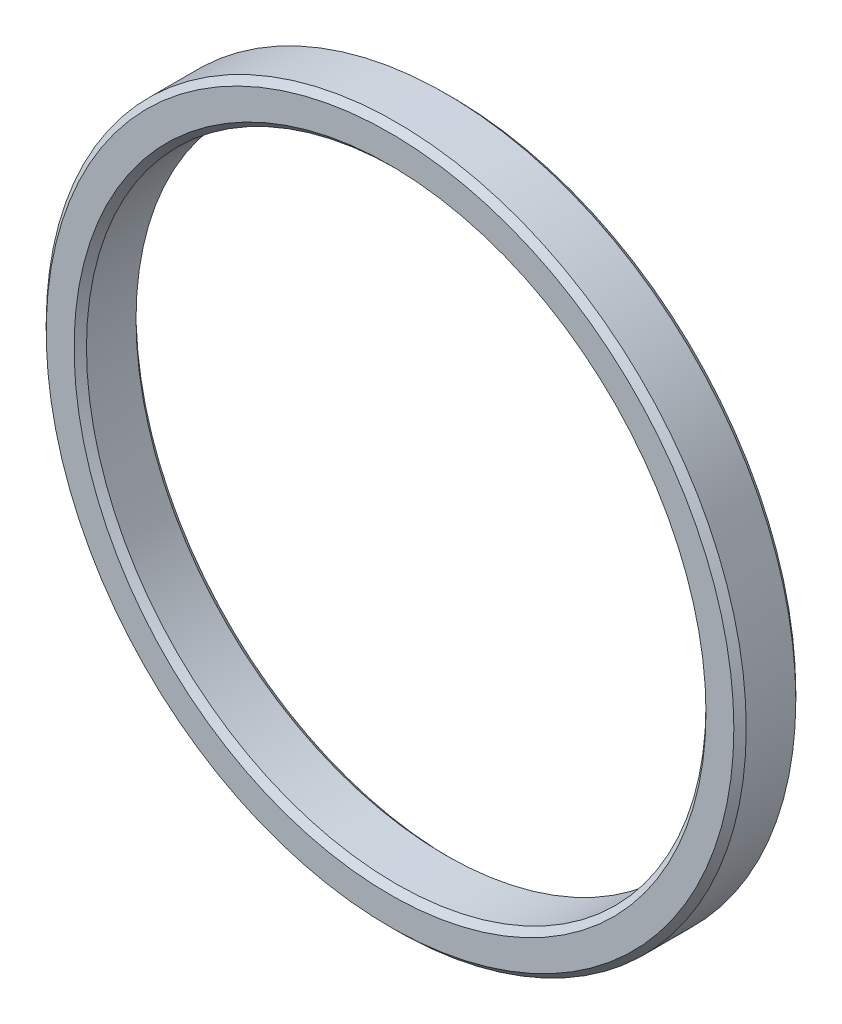
ISO-10303-21;
HEADER;
FILE_DESCRIPTION(('STEP AP214'),'2;1');
FILE_NAME('part.step','',(''),(''),'','','');
FILE_SCHEMA(('AUTOMOTIVE_DESIGN { 1 0 10303 214 1 1 1 1 }'));
ENDSEC;
DATA;
#1=APPLICATION_CONTEXT('core data for automotive mechanical design processes');
#2=APPLICATION_PROTOCOL_DEFINITION('international standard','automotive_design',2000,#1);
#3=PRODUCT_CONTEXT('',#1,'mechanical');
#4=PRODUCT('Part','Part','',(#3));
#5=PRODUCT_RELATED_PRODUCT_CATEGORY('part','',(#4));
#6=PRODUCT_DEFINITION_FORMATION('','',#4);
#7=PRODUCT_DEFINITION_CONTEXT('part definition',#1,'design');
#8=PRODUCT_DEFINITION('design','',#6,#7);
#9=PRODUCT_DEFINITION_SHAPE('','',#8);
#10=(LENGTH_UNIT() NAMED_UNIT(*) SI_UNIT(.MILLI.,.METRE.));
#11=(NAMED_UNIT(*) PLANE_ANGLE_UNIT() SI_UNIT($,.RADIAN.));
#12=(NAMED_UNIT(*) SI_UNIT($,.STERADIAN.) SOLID_ANGLE_UNIT());
#13=UNCERTAINTY_MEASURE_WITH_UNIT(LENGTH_MEASURE(1.E-05),#10,'distance_accuracy_value','');
#14=(GEOMETRIC_REPRESENTATION_CONTEXT(3) GLOBAL_UNCERTAINTY_ASSIGNED_CONTEXT((#13)) GLOBAL_UNIT_ASSIGNED_CONTEXT((#10,
#11,#12)) REPRESENTATION_CONTEXT('',''));
#15=CARTESIAN_POINT('',(0.,0.,0.));
#16=DIRECTION('',(0.,0.,1.));
#17=DIRECTION('',(1.,0.,0.));
#18=AXIS2_PLACEMENT_3D('',#15,#16,#17);
#19=CARTESIAN_POINT('',(0.,0.,10.));
#20=DIRECTION('',(0.,0.,1.));
#21=DIRECTION('',(1.,0.,0.));
#22=AXIS2_PLACEMENT_3D('',#19,#20,#21);
#23=PLANE('',#22);
#24=CARTESIAN_POINT('',(0.,0.,10.));
#25=DIRECTION('',(0.,0.,1.));
#26=DIRECTION('',(1.,0.,0.));
#27=AXIS2_PLACEMENT_3D('',#24,#25,#26);
#28=CIRCLE('',#27,102.);
#29=CARTESIAN_POINT('',(102.,0.,10.));
#30=VERTEX_POINT('',#29);
#31=EDGE_CURVE('E10',#30,#30,#28,.F.);
#32=ORIENTED_EDGE('',*,*,#31,.T.);
#33=EDGE_LOOP('',(#32));
#34=FACE_BOUND('',#33,.T.);
#35=CARTESIAN_POINT('',(0.,0.,10.));
#36=DIRECTION('',(0.,0.,1.));
#37=DIRECTION('',(1.,0.,0.));
#38=AXIS2_PLACEMENT_3D('',#35,#36,#37);
#39=CIRCLE('',#38,111.);
#40=CARTESIAN_POINT('',(111.,0.,10.));
#41=VERTEX_POINT('',#40);
#42=EDGE_CURVE('E41',#41,#41,#39,.T.);
#43=ORIENTED_EDGE('',*,*,#42,.T.);
#44=EDGE_LOOP('',(#43));
#45=FACE_BOUND('',#44,.T.);
#46=ADVANCED_FACE('F34',(#34,#45),#23,.T.);
#47=CARTESIAN_POINT('',(0.,0.,-10.));
#48=DIRECTION('',(0.,0.,1.));
#49=DIRECTION('',(1.,0.,0.));
#50=AXIS2_PLACEMENT_3D('',#47,#48,#49);
#51=PLANE('',#50);
#52=CARTESIAN_POINT('',(0.,0.,-10.));
#53=DIRECTION('',(0.,0.,1.));
#54=DIRECTION('',(1.,0.,0.));
#55=AXIS2_PLACEMENT_3D('',#52,#53,#54);
#56=CIRCLE('',#55,102.);
#57=CARTESIAN_POINT('',(102.,0.,-10.));
#58=VERTEX_POINT('',#57);
#59=EDGE_CURVE('E60',#58,#58,#56,.T.);
#60=ORIENTED_EDGE('',*,*,#59,.T.);
#61=EDGE_LOOP('',(#60));
#62=FACE_BOUND('',#61,.T.);
#63=CARTESIAN_POINT('',(0.,0.,-10.));
#64=DIRECTION('',(0.,0.,1.));
#65=DIRECTION('',(1.,0.,0.));
#66=AXIS2_PLACEMENT_3D('',#63,#64,#65);
#67=CIRCLE('',#66,111.);
#68=CARTESIAN_POINT('',(111.,0.,-10.));
#69=VERTEX_POINT('',#68);
#70=EDGE_CURVE('E63',#69,#69,#67,.F.);
#71=ORIENTED_EDGE('',*,*,#70,.T.);
#72=EDGE_LOOP('',(#71));
#73=FACE_BOUND('',#72,.T.);
#74=ADVANCED_FACE('F67',(#62,#73),#51,.F.);
#75=CARTESIAN_POINT('',(0.,0.,10.));
#76=DIRECTION('',(0.,0.,-1.));
#77=DIRECTION('',(-1.,0.,0.));
#78=AXIS2_PLACEMENT_3D('',#75,#76,#77);
#79=CYLINDRICAL_SURFACE('',#78,113.);
#80=CARTESIAN_POINT('',(0.,0.,-8.));
#81=DIRECTION('',(0.,0.,1.));
#82=DIRECTION('',(1.,0.,0.));
#83=AXIS2_PLACEMENT_3D('',#80,#81,#82);
#84=CIRCLE('',#83,113.);
#85=CARTESIAN_POINT('',(113.,0.,-8.));
#86=VERTEX_POINT('',#85);
#87=EDGE_CURVE('E45',#86,#86,#84,.T.);
#88=ORIENTED_EDGE('',*,*,#87,.T.);
#89=EDGE_LOOP('',(#88));
#90=FACE_BOUND('',#89,.T.);
#91=CARTESIAN_POINT('',(0.,0.,7.99999999999997));
#92=DIRECTION('',(0.,0.,1.));
#93=DIRECTION('',(1.,0.,0.));
#94=AXIS2_PLACEMENT_3D('',#91,#92,#93);
#95=CIRCLE('',#94,113.);
#96=CARTESIAN_POINT('',(113.,0.,7.99999999999997));
#97=VERTEX_POINT('',#96);
#98=EDGE_CURVE('E49',#97,#97,#95,.F.);
#99=ORIENTED_EDGE('',*,*,#98,.T.);
#100=EDGE_LOOP('',(#99));
#101=FACE_BOUND('',#100,.T.);
#102=ADVANCED_FACE('F77',(#90,#101),#79,.T.);
#103=CARTESIAN_POINT('',(0.,0.,10.));
#104=DIRECTION('',(0.,0.,-1.));
#105=DIRECTION('',(-1.,0.,0.));
#106=AXIS2_PLACEMENT_3D('',#103,#104,#105);
#107=CYLINDRICAL_SURFACE('',#106,100.);
#108=CARTESIAN_POINT('',(0.,0.,-8.));
#109=DIRECTION('',(0.,0.,1.));
#110=DIRECTION('',(1.,0.,0.));
#111=AXIS2_PLACEMENT_3D('',#108,#109,#110);
#112=CIRCLE('',#111,100.);
#113=CARTESIAN_POINT('',(100.,0.,-8.));
#114=VERTEX_POINT('',#113);
#115=EDGE_CURVE('E54',#114,#114,#112,.F.);
#116=ORIENTED_EDGE('',*,*,#115,.T.);
#117=EDGE_LOOP('',(#116));
#118=FACE_BOUND('',#117,.T.);
#119=CARTESIAN_POINT('',(0.,0.,7.9999999999999));
#120=DIRECTION('',(0.,0.,1.));
#121=DIRECTION('',(1.,0.,0.));
#122=AXIS2_PLACEMENT_3D('',#119,#120,#121);
#123=CIRCLE('',#122,100.);
#124=CARTESIAN_POINT('',(100.,0.,7.9999999999999));
#125=VERTEX_POINT('',#124);
#126=EDGE_CURVE('E57',#125,#125,#123,.T.);
#127=ORIENTED_EDGE('',*,*,#126,.T.);
#128=EDGE_LOOP('',(#127));
#129=FACE_BOUND('',#128,.T.);
#130=ADVANCED_FACE('F80',(#118,#129),#107,.F.);
#131=CARTESIAN_POINT('',(0.,0.,-10.));
#132=DIRECTION('',(0.,0.,-1.));
#133=DIRECTION('',(-1.,0.,0.));
#134=AXIS2_PLACEMENT_3D('',#131,#132,#133);
#135=CONICAL_SURFACE('',#134,102.,0.785398163397445);
#136=ORIENTED_EDGE('',*,*,#115,.F.);
#137=EDGE_LOOP('',(#136));
#138=FACE_BOUND('',#137,.T.);
#139=ORIENTED_EDGE('',*,*,#59,.F.);
#140=EDGE_LOOP('',(#139));
#141=FACE_BOUND('',#140,.T.);
#142=ADVANCED_FACE('F73',(#138,#141),#135,.F.);
#143=CARTESIAN_POINT('',(0.,0.,-8.));
#144=DIRECTION('',(0.,0.,1.));
#145=DIRECTION('',(1.,0.,0.));
#146=AXIS2_PLACEMENT_3D('',#143,#144,#145);
#147=CONICAL_SURFACE('',#146,113.,0.785398163397452);
#148=ORIENTED_EDGE('',*,*,#70,.F.);
#149=EDGE_LOOP('',(#148));
#150=FACE_BOUND('',#149,.T.);
#151=ORIENTED_EDGE('',*,*,#87,.F.);
#152=EDGE_LOOP('',(#151));
#153=FACE_BOUND('',#152,.T.);
#154=ADVANCED_FACE('F69',(#150,#153),#147,.T.);
#155=CARTESIAN_POINT('',(0.,0.,7.9999999999999));
#156=DIRECTION('',(0.,0.,1.));
#157=DIRECTION('',(1.,0.,0.));
#158=AXIS2_PLACEMENT_3D('',#155,#156,#157);
#159=CONICAL_SURFACE('',#158,100.,0.785398163397445);
#160=ORIENTED_EDGE('',*,*,#31,.F.);
#161=EDGE_LOOP('',(#160));
#162=FACE_BOUND('',#161,.T.);
#163=ORIENTED_EDGE('',*,*,#126,.F.);
#164=EDGE_LOOP('',(#163));
#165=FACE_BOUND('',#164,.T.);
#166=ADVANCED_FACE('F72',(#162,#165),#159,.F.);
#167=CARTESIAN_POINT('',(0.,0.,10.));
#168=DIRECTION('',(0.,0.,-1.));
#169=DIRECTION('',(-1.,0.,0.));
#170=AXIS2_PLACEMENT_3D('',#167,#168,#169);
#171=CONICAL_SURFACE('',#170,111.,0.785398163397441);
#172=ORIENTED_EDGE('',*,*,#98,.F.);
#173=EDGE_LOOP('',(#172));
#174=FACE_BOUND('',#173,.T.);
#175=ORIENTED_EDGE('',*,*,#42,.F.);
#176=EDGE_LOOP('',(#175));
#177=FACE_BOUND('',#176,.T.);
#178=ADVANCED_FACE('F36',(#174,#177),#171,.T.);
#179=CLOSED_SHELL('',(#46,#74,#102,#130,#142,#154,#166,#178));
#180=MANIFOLD_SOLID_BREP('B2',#179);
#181=ADVANCED_BREP_SHAPE_REPRESENTATION('',(#18,#180),#14);
#182=SHAPE_DEFINITION_REPRESENTATION(#9,#181);
ENDSEC;
END-ISO-10303-21;
